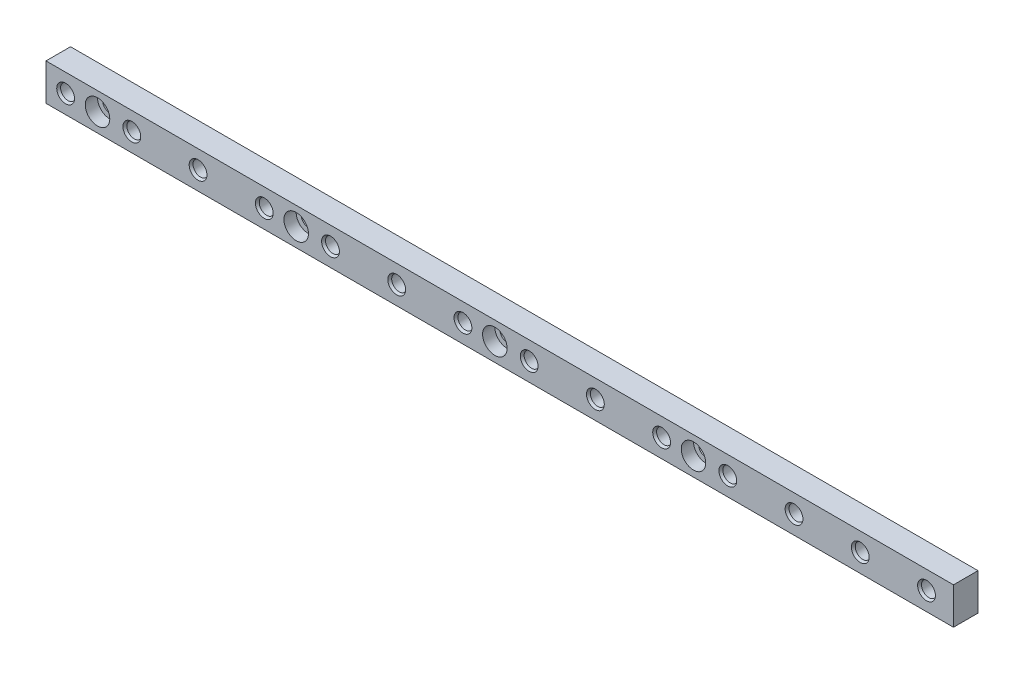
ISO-10303-21;
HEADER;
FILE_DESCRIPTION(('STEP AP214'),'2;1');
FILE_NAME('part.step','',(''),(''),'','','');
FILE_SCHEMA(('AUTOMOTIVE_DESIGN { 1 0 10303 214 1 1 1 1 }'));
ENDSEC;
DATA;
#1=APPLICATION_CONTEXT('core data for automotive mechanical design processes');
#2=APPLICATION_PROTOCOL_DEFINITION('international standard','automotive_design',2000,#1);
#3=PRODUCT_CONTEXT('',#1,'mechanical');
#4=PRODUCT('Part','Part','',(#3));
#5=PRODUCT_RELATED_PRODUCT_CATEGORY('part','',(#4));
#6=PRODUCT_DEFINITION_FORMATION('','',#4);
#7=PRODUCT_DEFINITION_CONTEXT('part definition',#1,'design');
#8=PRODUCT_DEFINITION('design','',#6,#7);
#9=PRODUCT_DEFINITION_SHAPE('','',#8);
#10=(LENGTH_UNIT() NAMED_UNIT(*) SI_UNIT(.MILLI.,.METRE.));
#11=(NAMED_UNIT(*) PLANE_ANGLE_UNIT() SI_UNIT($,.RADIAN.));
#12=(NAMED_UNIT(*) SI_UNIT($,.STERADIAN.) SOLID_ANGLE_UNIT());
#13=UNCERTAINTY_MEASURE_WITH_UNIT(LENGTH_MEASURE(1.E-05),#10,'distance_accuracy_value','');
#14=(GEOMETRIC_REPRESENTATION_CONTEXT(3) GLOBAL_UNCERTAINTY_ASSIGNED_CONTEXT((#13)) GLOBAL_UNIT_ASSIGNED_CONTEXT((#10,
#11,#12)) REPRESENTATION_CONTEXT('',''));
#15=CARTESIAN_POINT('',(0.,0.,0.));
#16=DIRECTION('',(0.,0.,1.));
#17=DIRECTION('',(1.,0.,0.));
#18=AXIS2_PLACEMENT_3D('',#15,#16,#17);
#19=CARTESIAN_POINT('',(0.,0.,10.));
#20=DIRECTION('',(1.,0.,0.));
#21=DIRECTION('',(0.,0.,-1.));
#22=AXIS2_PLACEMENT_3D('',#19,#20,#21);
#23=PLANE('',#22);
#24=DIRECTION('',(0.,-1.,0.));
#25=VECTOR('',#24,1.);
#26=CARTESIAN_POINT('',(0.,0.,0.));
#27=LINE('',#26,#25);
#28=CARTESIAN_POINT('',(0.,15.,0.));
#29=VERTEX_POINT('',#28);
#30=CARTESIAN_POINT('',(0.,0.,0.));
#31=VERTEX_POINT('',#30);
#32=EDGE_CURVE('E105',#29,#31,#27,.T.);
#33=ORIENTED_EDGE('',*,*,#32,.T.);
#34=DIRECTION('',(0.,0.,-1.));
#35=VECTOR('',#34,1.);
#36=CARTESIAN_POINT('',(0.,0.,10.));
#37=LINE('',#36,#35);
#38=CARTESIAN_POINT('',(0.,0.,10.));
#39=VERTEX_POINT('',#38);
#40=EDGE_CURVE('E96',#39,#31,#37,.T.);
#41=ORIENTED_EDGE('',*,*,#40,.F.);
#42=DIRECTION('',(0.,-1.,0.));
#43=VECTOR('',#42,1.);
#44=CARTESIAN_POINT('',(0.,0.,10.));
#45=LINE('',#44,#43);
#46=CARTESIAN_POINT('',(0.,15.,10.));
#47=VERTEX_POINT('',#46);
#48=EDGE_CURVE('E90',#47,#39,#45,.T.);
#49=ORIENTED_EDGE('',*,*,#48,.F.);
#50=DIRECTION('',(0.,0.,-1.));
#51=VECTOR('',#50,1.);
#52=CARTESIAN_POINT('',(0.,15.,10.));
#53=LINE('',#52,#51);
#54=EDGE_CURVE('E101',#47,#29,#53,.T.);
#55=ORIENTED_EDGE('',*,*,#54,.T.);
#56=EDGE_LOOP('',(#33,#41,#49,#55));
#57=FACE_BOUND('',#56,.T.);
#58=ADVANCED_FACE('F37',(#57),#23,.F.);
#59=CARTESIAN_POINT('',(0.,0.,10.));
#60=DIRECTION('',(0.,1.,0.));
#61=DIRECTION('',(0.,0.,1.));
#62=AXIS2_PLACEMENT_3D('',#59,#60,#61);
#63=PLANE('',#62);
#64=DIRECTION('',(1.,0.,0.));
#65=VECTOR('',#64,1.);
#66=CARTESIAN_POINT('',(0.,0.,0.));
#67=LINE('',#66,#65);
#68=CARTESIAN_POINT('',(370.,0.,0.));
#69=VERTEX_POINT('',#68);
#70=EDGE_CURVE('E95',#31,#69,#67,.T.);
#71=ORIENTED_EDGE('',*,*,#70,.T.);
#72=DIRECTION('',(0.,0.,-1.));
#73=VECTOR('',#72,1.);
#74=CARTESIAN_POINT('',(370.,0.,10.));
#75=LINE('',#74,#73);
#76=CARTESIAN_POINT('',(370.,0.,10.));
#77=VERTEX_POINT('',#76);
#78=EDGE_CURVE('E93',#77,#69,#75,.T.);
#79=ORIENTED_EDGE('',*,*,#78,.F.);
#80=DIRECTION('',(1.,0.,0.));
#81=VECTOR('',#80,1.);
#82=CARTESIAN_POINT('',(0.,0.,10.));
#83=LINE('',#82,#81);
#84=EDGE_CURVE('E85',#39,#77,#83,.T.);
#85=ORIENTED_EDGE('',*,*,#84,.F.);
#86=ORIENTED_EDGE('',*,*,#40,.T.);
#87=EDGE_LOOP('',(#71,#79,#85,#86));
#88=FACE_BOUND('',#87,.T.);
#89=ADVANCED_FACE('F94',(#88),#63,.F.);
#90=CARTESIAN_POINT('',(370.,0.,10.));
#91=DIRECTION('',(-1.,0.,0.));
#92=DIRECTION('',(0.,0.,1.));
#93=AXIS2_PLACEMENT_3D('',#90,#91,#92);
#94=PLANE('',#93);
#95=DIRECTION('',(0.,1.,0.));
#96=VECTOR('',#95,1.);
#97=CARTESIAN_POINT('',(370.,0.,0.));
#98=LINE('',#97,#96);
#99=CARTESIAN_POINT('',(370.,15.,0.));
#100=VERTEX_POINT('',#99);
#101=EDGE_CURVE('E71',#69,#100,#98,.T.);
#102=ORIENTED_EDGE('',*,*,#101,.T.);
#103=DIRECTION('',(0.,0.,-1.));
#104=VECTOR('',#103,1.);
#105=CARTESIAN_POINT('',(370.,15.,10.));
#106=LINE('',#105,#104);
#107=CARTESIAN_POINT('',(370.,15.,10.));
#108=VERTEX_POINT('',#107);
#109=EDGE_CURVE('E97',#108,#100,#106,.T.);
#110=ORIENTED_EDGE('',*,*,#109,.F.);
#111=DIRECTION('',(0.,1.,0.));
#112=VECTOR('',#111,1.);
#113=CARTESIAN_POINT('',(370.,0.,10.));
#114=LINE('',#113,#112);
#115=EDGE_CURVE('E88',#77,#108,#114,.T.);
#116=ORIENTED_EDGE('',*,*,#115,.F.);
#117=ORIENTED_EDGE('',*,*,#78,.T.);
#118=EDGE_LOOP('',(#102,#110,#116,#117));
#119=FACE_BOUND('',#118,.T.);
#120=ADVANCED_FACE('F99',(#119),#94,.F.);
#121=CARTESIAN_POINT('',(0.,15.,10.));
#122=DIRECTION('',(0.,-1.,0.));
#123=DIRECTION('',(0.,0.,-1.));
#124=AXIS2_PLACEMENT_3D('',#121,#122,#123);
#125=PLANE('',#124);
#126=DIRECTION('',(-1.,0.,0.));
#127=VECTOR('',#126,1.);
#128=CARTESIAN_POINT('',(0.,15.,0.));
#129=LINE('',#128,#127);
#130=EDGE_CURVE('E77',#100,#29,#129,.T.);
#131=ORIENTED_EDGE('',*,*,#130,.T.);
#132=ORIENTED_EDGE('',*,*,#54,.F.);
#133=DIRECTION('',(-1.,0.,0.));
#134=VECTOR('',#133,1.);
#135=CARTESIAN_POINT('',(0.,15.,10.));
#136=LINE('',#135,#134);
#137=EDGE_CURVE('E54',#108,#47,#136,.T.);
#138=ORIENTED_EDGE('',*,*,#137,.F.);
#139=ORIENTED_EDGE('',*,*,#109,.T.);
#140=EDGE_LOOP('',(#131,#132,#138,#139));
#141=FACE_BOUND('',#140,.T.);
#142=ADVANCED_FACE('F397',(#141),#125,.F.);
#143=CARTESIAN_POINT('',(0.,15.,10.));
#144=DIRECTION('',(0.,0.,-1.));
#145=DIRECTION('',(-1.,0.,0.));
#146=AXIS2_PLACEMENT_3D('',#143,#144,#145);
#147=PLANE('',#146);
#148=CARTESIAN_POINT('',(359.,7.5,10.));
#149=DIRECTION('',(0.,0.,-1.));
#150=DIRECTION('',(-1.,0.,0.));
#151=AXIS2_PLACEMENT_3D('',#148,#149,#150);
#152=CIRCLE('',#151,3.62735026918959);
#153=CARTESIAN_POINT('',(355.37264973081,7.5,10.));
#154=VERTEX_POINT('',#153);
#155=EDGE_CURVE('E193',#154,#154,#152,.T.);
#156=ORIENTED_EDGE('',*,*,#155,.T.);
#157=EDGE_LOOP('',(#156));
#158=FACE_BOUND('',#157,.T.);
#159=CARTESIAN_POINT('',(332.,7.5,10.));
#160=DIRECTION('',(0.,0.,-1.));
#161=DIRECTION('',(-1.,0.,0.));
#162=AXIS2_PLACEMENT_3D('',#159,#160,#161);
#163=CIRCLE('',#162,3.6273502691897);
#164=CARTESIAN_POINT('',(328.37264973081,7.5,10.));
#165=VERTEX_POINT('',#164);
#166=EDGE_CURVE('E190',#165,#165,#163,.T.);
#167=ORIENTED_EDGE('',*,*,#166,.T.);
#168=EDGE_LOOP('',(#167));
#169=FACE_BOUND('',#168,.T.);
#170=CARTESIAN_POINT('',(305.,7.5,10.));
#171=DIRECTION('',(0.,0.,-1.));
#172=DIRECTION('',(-1.,0.,0.));
#173=AXIS2_PLACEMENT_3D('',#170,#171,#172);
#174=CIRCLE('',#173,3.62735026918959);
#175=CARTESIAN_POINT('',(301.37264973081,7.5,10.));
#176=VERTEX_POINT('',#175);
#177=EDGE_CURVE('E187',#176,#176,#174,.T.);
#178=ORIENTED_EDGE('',*,*,#177,.T.);
#179=EDGE_LOOP('',(#178));
#180=FACE_BOUND('',#179,.T.);
#181=CARTESIAN_POINT('',(278.,7.5,10.));
#182=DIRECTION('',(0.,0.,-1.));
#183=DIRECTION('',(-1.,0.,0.));
#184=AXIS2_PLACEMENT_3D('',#181,#182,#183);
#185=CIRCLE('',#184,3.62735026918959);
#186=CARTESIAN_POINT('',(274.37264973081,7.5,10.));
#187=VERTEX_POINT('',#186);
#188=EDGE_CURVE('E184',#187,#187,#185,.T.);
#189=ORIENTED_EDGE('',*,*,#188,.T.);
#190=EDGE_LOOP('',(#189));
#191=FACE_BOUND('',#190,.T.);
#192=CARTESIAN_POINT('',(251.,7.5,10.));
#193=DIRECTION('',(0.,0.,-1.));
#194=DIRECTION('',(-1.,0.,0.));
#195=AXIS2_PLACEMENT_3D('',#192,#193,#194);
#196=CIRCLE('',#195,3.62735026918964);
#197=CARTESIAN_POINT('',(247.37264973081,7.5,10.));
#198=VERTEX_POINT('',#197);
#199=EDGE_CURVE('E181',#198,#198,#196,.T.);
#200=ORIENTED_EDGE('',*,*,#199,.T.);
#201=EDGE_LOOP('',(#200));
#202=FACE_BOUND('',#201,.T.);
#203=CARTESIAN_POINT('',(224.,7.5,10.));
#204=DIRECTION('',(0.,0.,-1.));
#205=DIRECTION('',(-1.,0.,0.));
#206=AXIS2_PLACEMENT_3D('',#203,#204,#205);
#207=CIRCLE('',#206,3.62735026918959);
#208=CARTESIAN_POINT('',(220.37264973081,7.5,10.));
#209=VERTEX_POINT('',#208);
#210=EDGE_CURVE('E178',#209,#209,#207,.T.);
#211=ORIENTED_EDGE('',*,*,#210,.T.);
#212=EDGE_LOOP('',(#211));
#213=FACE_BOUND('',#212,.T.);
#214=CARTESIAN_POINT('',(197.,7.5,10.));
#215=DIRECTION('',(0.,0.,-1.));
#216=DIRECTION('',(-1.,0.,0.));
#217=AXIS2_PLACEMENT_3D('',#214,#215,#216);
#218=CIRCLE('',#217,3.62735026918959);
#219=CARTESIAN_POINT('',(193.37264973081,7.5,10.));
#220=VERTEX_POINT('',#219);
#221=EDGE_CURVE('E175',#220,#220,#218,.T.);
#222=ORIENTED_EDGE('',*,*,#221,.T.);
#223=EDGE_LOOP('',(#222));
#224=FACE_BOUND('',#223,.T.);
#225=CARTESIAN_POINT('',(170.,7.5,10.));
#226=DIRECTION('',(0.,0.,-1.));
#227=DIRECTION('',(-1.,0.,0.));
#228=AXIS2_PLACEMENT_3D('',#225,#226,#227);
#229=CIRCLE('',#228,3.6273502691897);
#230=CARTESIAN_POINT('',(166.37264973081,7.5,10.));
#231=VERTEX_POINT('',#230);
#232=EDGE_CURVE('E172',#231,#231,#229,.T.);
#233=ORIENTED_EDGE('',*,*,#232,.T.);
#234=EDGE_LOOP('',(#233));
#235=FACE_BOUND('',#234,.T.);
#236=CARTESIAN_POINT('',(143.,7.5,10.));
#237=DIRECTION('',(0.,0.,-1.));
#238=DIRECTION('',(-1.,0.,0.));
#239=AXIS2_PLACEMENT_3D('',#236,#237,#238);
#240=CIRCLE('',#239,3.62735026918959);
#241=CARTESIAN_POINT('',(139.37264973081,7.5,10.));
#242=VERTEX_POINT('',#241);
#243=EDGE_CURVE('E169',#242,#242,#240,.T.);
#244=ORIENTED_EDGE('',*,*,#243,.T.);
#245=EDGE_LOOP('',(#244));
#246=FACE_BOUND('',#245,.T.);
#247=CARTESIAN_POINT('',(116.,7.5,10.));
#248=DIRECTION('',(0.,0.,-1.));
#249=DIRECTION('',(-1.,0.,0.));
#250=AXIS2_PLACEMENT_3D('',#247,#248,#249);
#251=CIRCLE('',#250,3.62735026918959);
#252=CARTESIAN_POINT('',(112.37264973081,7.5,10.));
#253=VERTEX_POINT('',#252);
#254=EDGE_CURVE('E166',#253,#253,#251,.T.);
#255=ORIENTED_EDGE('',*,*,#254,.T.);
#256=EDGE_LOOP('',(#255));
#257=FACE_BOUND('',#256,.T.);
#258=CARTESIAN_POINT('',(89.,7.5,10.));
#259=DIRECTION('',(0.,0.,-1.));
#260=DIRECTION('',(-1.,0.,0.));
#261=AXIS2_PLACEMENT_3D('',#258,#259,#260);
#262=CIRCLE('',#261,3.62735026918959);
#263=CARTESIAN_POINT('',(85.3726497308104,7.5,10.));
#264=VERTEX_POINT('',#263);
#265=EDGE_CURVE('E163',#264,#264,#262,.T.);
#266=ORIENTED_EDGE('',*,*,#265,.T.);
#267=EDGE_LOOP('',(#266));
#268=FACE_BOUND('',#267,.T.);
#269=CARTESIAN_POINT('',(62.,7.5,10.));
#270=DIRECTION('',(0.,0.,-1.));
#271=DIRECTION('',(-1.,0.,0.));
#272=AXIS2_PLACEMENT_3D('',#269,#270,#271);
#273=CIRCLE('',#272,3.62735026918964);
#274=CARTESIAN_POINT('',(58.3726497308104,7.5,10.));
#275=VERTEX_POINT('',#274);
#276=EDGE_CURVE('E160',#275,#275,#273,.T.);
#277=ORIENTED_EDGE('',*,*,#276,.T.);
#278=EDGE_LOOP('',(#277));
#279=FACE_BOUND('',#278,.T.);
#280=CARTESIAN_POINT('',(35.,7.5,10.));
#281=DIRECTION('',(0.,0.,-1.));
#282=DIRECTION('',(-1.,0.,0.));
#283=AXIS2_PLACEMENT_3D('',#280,#281,#282);
#284=CIRCLE('',#283,3.62735026918964);
#285=CARTESIAN_POINT('',(31.3726497308104,7.5,10.));
#286=VERTEX_POINT('',#285);
#287=EDGE_CURVE('E157',#286,#286,#284,.T.);
#288=ORIENTED_EDGE('',*,*,#287,.T.);
#289=EDGE_LOOP('',(#288));
#290=FACE_BOUND('',#289,.T.);
#291=CARTESIAN_POINT('',(8.,7.5,10.));
#292=DIRECTION('',(0.,0.,-1.));
#293=DIRECTION('',(-1.,0.,0.));
#294=AXIS2_PLACEMENT_3D('',#291,#292,#293);
#295=CIRCLE('',#294,3.62735026918962);
#296=CARTESIAN_POINT('',(4.37264973081039,7.5,10.));
#297=VERTEX_POINT('',#296);
#298=EDGE_CURVE('E154',#297,#297,#295,.T.);
#299=ORIENTED_EDGE('',*,*,#298,.T.);
#300=EDGE_LOOP('',(#299));
#301=FACE_BOUND('',#300,.T.);
#302=CARTESIAN_POINT('',(21.,7.5,10.));
#303=DIRECTION('',(0.,0.,1.));
#304=DIRECTION('',(1.,0.,0.));
#305=AXIS2_PLACEMENT_3D('',#302,#303,#304);
#306=CIRCLE('',#305,5.);
#307=CARTESIAN_POINT('',(26.,7.5,10.));
#308=VERTEX_POINT('',#307);
#309=EDGE_CURVE('E798',#308,#308,#306,.T.);
#310=ORIENTED_EDGE('',*,*,#309,.F.);
#311=EDGE_LOOP('',(#310));
#312=FACE_BOUND('',#311,.T.);
#313=CARTESIAN_POINT('',(102.,7.5,10.));
#314=DIRECTION('',(0.,0.,1.));
#315=DIRECTION('',(1.,0.,0.));
#316=AXIS2_PLACEMENT_3D('',#313,#314,#315);
#317=CIRCLE('',#316,5.);
#318=CARTESIAN_POINT('',(107.,7.5,10.));
#319=VERTEX_POINT('',#318);
#320=EDGE_CURVE('E787',#319,#319,#317,.T.);
#321=ORIENTED_EDGE('',*,*,#320,.F.);
#322=EDGE_LOOP('',(#321));
#323=FACE_BOUND('',#322,.T.);
#324=CARTESIAN_POINT('',(183.,7.5,10.));
#325=DIRECTION('',(0.,0.,1.));
#326=DIRECTION('',(1.,0.,0.));
#327=AXIS2_PLACEMENT_3D('',#324,#325,#326);
#328=CIRCLE('',#327,5.);
#329=CARTESIAN_POINT('',(188.,7.5,10.));
#330=VERTEX_POINT('',#329);
#331=EDGE_CURVE('E775',#330,#330,#328,.T.);
#332=ORIENTED_EDGE('',*,*,#331,.F.);
#333=EDGE_LOOP('',(#332));
#334=FACE_BOUND('',#333,.T.);
#335=CARTESIAN_POINT('',(264.,7.5,10.));
#336=DIRECTION('',(0.,0.,1.));
#337=DIRECTION('',(1.,0.,0.));
#338=AXIS2_PLACEMENT_3D('',#335,#336,#337);
#339=CIRCLE('',#338,5.);
#340=CARTESIAN_POINT('',(269.,7.5,10.));
#341=VERTEX_POINT('',#340);
#342=EDGE_CURVE('E747',#341,#341,#339,.T.);
#343=ORIENTED_EDGE('',*,*,#342,.F.);
#344=EDGE_LOOP('',(#343));
#345=FACE_BOUND('',#344,.T.);
#346=ORIENTED_EDGE('',*,*,#48,.T.);
#347=ORIENTED_EDGE('',*,*,#84,.T.);
#348=ORIENTED_EDGE('',*,*,#115,.T.);
#349=ORIENTED_EDGE('',*,*,#137,.T.);
#350=EDGE_LOOP('',(#346,#347,#348,#349));
#351=FACE_BOUND('',#350,.T.);
#352=ADVANCED_FACE('F86',(#158,#169,#180,#191,#202,#213,#224,#235,#246,#257,#268,#279,#290,#301,
#312,#323,#334,#345,#351),#147,.F.);
#353=CARTESIAN_POINT('',(0.,15.,0.));
#354=DIRECTION('',(0.,0.,-1.));
#355=DIRECTION('',(-1.,0.,0.));
#356=AXIS2_PLACEMENT_3D('',#353,#354,#355);
#357=PLANE('',#356);
#358=CARTESIAN_POINT('',(21.,7.5,0.));
#359=DIRECTION('',(0.,0.,1.));
#360=DIRECTION('',(1.,0.,0.));
#361=AXIS2_PLACEMENT_3D('',#358,#359,#360);
#362=CIRCLE('',#361,2.9);
#363=CARTESIAN_POINT('',(23.9,7.5,0.));
#364=VERTEX_POINT('',#363);
#365=EDGE_CURVE('E790',#364,#364,#362,.T.);
#366=ORIENTED_EDGE('',*,*,#365,.T.);
#367=EDGE_LOOP('',(#366));
#368=FACE_BOUND('',#367,.T.);
#369=CARTESIAN_POINT('',(102.,7.5,0.));
#370=DIRECTION('',(0.,0.,1.));
#371=DIRECTION('',(1.,0.,0.));
#372=AXIS2_PLACEMENT_3D('',#369,#370,#371);
#373=CIRCLE('',#372,2.9);
#374=CARTESIAN_POINT('',(104.9,7.5,0.));
#375=VERTEX_POINT('',#374);
#376=EDGE_CURVE('E778',#375,#375,#373,.T.);
#377=ORIENTED_EDGE('',*,*,#376,.T.);
#378=EDGE_LOOP('',(#377));
#379=FACE_BOUND('',#378,.T.);
#380=CARTESIAN_POINT('',(183.,7.5,0.));
#381=DIRECTION('',(0.,0.,1.));
#382=DIRECTION('',(1.,0.,0.));
#383=AXIS2_PLACEMENT_3D('',#380,#381,#382);
#384=CIRCLE('',#383,2.89999999999999);
#385=CARTESIAN_POINT('',(185.9,7.5,0.));
#386=VERTEX_POINT('',#385);
#387=EDGE_CURVE('E766',#386,#386,#384,.T.);
#388=ORIENTED_EDGE('',*,*,#387,.T.);
#389=EDGE_LOOP('',(#388));
#390=FACE_BOUND('',#389,.T.);
#391=CARTESIAN_POINT('',(264.,7.5,0.));
#392=DIRECTION('',(0.,0.,1.));
#393=DIRECTION('',(1.,0.,0.));
#394=AXIS2_PLACEMENT_3D('',#391,#392,#393);
#395=CIRCLE('',#394,2.90000000000001);
#396=CARTESIAN_POINT('',(266.9,7.5,0.));
#397=VERTEX_POINT('',#396);
#398=EDGE_CURVE('E738',#397,#397,#395,.T.);
#399=ORIENTED_EDGE('',*,*,#398,.T.);
#400=EDGE_LOOP('',(#399));
#401=FACE_BOUND('',#400,.T.);
#402=CARTESIAN_POINT('',(35.,7.5,0.));
#403=DIRECTION('',(0.,0.,1.));
#404=DIRECTION('',(1.,0.,0.));
#405=AXIS2_PLACEMENT_3D('',#402,#403,#404);
#406=CIRCLE('',#405,3.05);
#407=CARTESIAN_POINT('',(38.05,7.5,0.));
#408=VERTEX_POINT('',#407);
#409=EDGE_CURVE('E744',#408,#408,#406,.T.);
#410=ORIENTED_EDGE('',*,*,#409,.T.);
#411=EDGE_LOOP('',(#410));
#412=FACE_BOUND('',#411,.T.);
#413=CARTESIAN_POINT('',(8.,7.5,0.));
#414=DIRECTION('',(0.,0.,1.));
#415=DIRECTION('',(1.,0.,0.));
#416=AXIS2_PLACEMENT_3D('',#413,#414,#415);
#417=CIRCLE('',#416,3.05);
#418=CARTESIAN_POINT('',(11.05,7.5,0.));
#419=VERTEX_POINT('',#418);
#420=EDGE_CURVE('E108',#419,#419,#417,.T.);
#421=ORIENTED_EDGE('',*,*,#420,.T.);
#422=EDGE_LOOP('',(#421));
#423=FACE_BOUND('',#422,.T.);
#424=ORIENTED_EDGE('',*,*,#32,.F.);
#425=ORIENTED_EDGE('',*,*,#130,.F.);
#426=ORIENTED_EDGE('',*,*,#101,.F.);
#427=ORIENTED_EDGE('',*,*,#70,.F.);
#428=EDGE_LOOP('',(#424,#425,#426,#427));
#429=FACE_BOUND('',#428,.T.);
#430=CARTESIAN_POINT('',(62.,7.5,0.));
#431=DIRECTION('',(0.,0.,1.));
#432=DIRECTION('',(1.,0.,0.));
#433=AXIS2_PLACEMENT_3D('',#430,#431,#432);
#434=CIRCLE('',#433,3.05);
#435=CARTESIAN_POINT('',(65.05,7.5,0.));
#436=VERTEX_POINT('',#435);
#437=EDGE_CURVE('E115',#436,#436,#434,.T.);
#438=ORIENTED_EDGE('',*,*,#437,.T.);
#439=EDGE_LOOP('',(#438));
#440=FACE_BOUND('',#439,.T.);
#441=CARTESIAN_POINT('',(89.,7.5,0.));
#442=DIRECTION('',(0.,0.,1.));
#443=DIRECTION('',(1.,0.,0.));
#444=AXIS2_PLACEMENT_3D('',#441,#442,#443);
#445=CIRCLE('',#444,3.05);
#446=CARTESIAN_POINT('',(92.05,7.5,0.));
#447=VERTEX_POINT('',#446);
#448=EDGE_CURVE('E118',#447,#447,#445,.T.);
#449=ORIENTED_EDGE('',*,*,#448,.T.);
#450=EDGE_LOOP('',(#449));
#451=FACE_BOUND('',#450,.T.);
#452=CARTESIAN_POINT('',(116.,7.5,0.));
#453=DIRECTION('',(0.,0.,1.));
#454=DIRECTION('',(1.,0.,0.));
#455=AXIS2_PLACEMENT_3D('',#452,#453,#454);
#456=CIRCLE('',#455,3.05);
#457=CARTESIAN_POINT('',(119.05,7.5,0.));
#458=VERTEX_POINT('',#457);
#459=EDGE_CURVE('E121',#458,#458,#456,.T.);
#460=ORIENTED_EDGE('',*,*,#459,.T.);
#461=EDGE_LOOP('',(#460));
#462=FACE_BOUND('',#461,.T.);
#463=CARTESIAN_POINT('',(143.,7.5,0.));
#464=DIRECTION('',(0.,0.,1.));
#465=DIRECTION('',(1.,0.,0.));
#466=AXIS2_PLACEMENT_3D('',#463,#464,#465);
#467=CIRCLE('',#466,3.05);
#468=CARTESIAN_POINT('',(146.05,7.5,0.));
#469=VERTEX_POINT('',#468);
#470=EDGE_CURVE('E124',#469,#469,#467,.T.);
#471=ORIENTED_EDGE('',*,*,#470,.T.);
#472=EDGE_LOOP('',(#471));
#473=FACE_BOUND('',#472,.T.);
#474=CARTESIAN_POINT('',(170.,7.5,0.));
#475=DIRECTION('',(0.,0.,1.));
#476=DIRECTION('',(1.,0.,0.));
#477=AXIS2_PLACEMENT_3D('',#474,#475,#476);
#478=CIRCLE('',#477,3.05);
#479=CARTESIAN_POINT('',(173.05,7.5,0.));
#480=VERTEX_POINT('',#479);
#481=EDGE_CURVE('E127',#480,#480,#478,.T.);
#482=ORIENTED_EDGE('',*,*,#481,.T.);
#483=EDGE_LOOP('',(#482));
#484=FACE_BOUND('',#483,.T.);
#485=CARTESIAN_POINT('',(197.,7.5,0.));
#486=DIRECTION('',(0.,0.,1.));
#487=DIRECTION('',(1.,0.,0.));
#488=AXIS2_PLACEMENT_3D('',#485,#486,#487);
#489=CIRCLE('',#488,3.05);
#490=CARTESIAN_POINT('',(200.05,7.5,0.));
#491=VERTEX_POINT('',#490);
#492=EDGE_CURVE('E130',#491,#491,#489,.T.);
#493=ORIENTED_EDGE('',*,*,#492,.T.);
#494=EDGE_LOOP('',(#493));
#495=FACE_BOUND('',#494,.T.);
#496=CARTESIAN_POINT('',(224.,7.5,0.));
#497=DIRECTION('',(0.,0.,1.));
#498=DIRECTION('',(1.,0.,0.));
#499=AXIS2_PLACEMENT_3D('',#496,#497,#498);
#500=CIRCLE('',#499,3.05);
#501=CARTESIAN_POINT('',(227.05,7.5,0.));
#502=VERTEX_POINT('',#501);
#503=EDGE_CURVE('E133',#502,#502,#500,.T.);
#504=ORIENTED_EDGE('',*,*,#503,.T.);
#505=EDGE_LOOP('',(#504));
#506=FACE_BOUND('',#505,.T.);
#507=CARTESIAN_POINT('',(251.,7.5,0.));
#508=DIRECTION('',(0.,0.,1.));
#509=DIRECTION('',(1.,0.,0.));
#510=AXIS2_PLACEMENT_3D('',#507,#508,#509);
#511=CIRCLE('',#510,3.05);
#512=CARTESIAN_POINT('',(254.05,7.5,0.));
#513=VERTEX_POINT('',#512);
#514=EDGE_CURVE('E136',#513,#513,#511,.T.);
#515=ORIENTED_EDGE('',*,*,#514,.T.);
#516=EDGE_LOOP('',(#515));
#517=FACE_BOUND('',#516,.T.);
#518=CARTESIAN_POINT('',(278.,7.5,0.));
#519=DIRECTION('',(0.,0.,1.));
#520=DIRECTION('',(1.,0.,0.));
#521=AXIS2_PLACEMENT_3D('',#518,#519,#520);
#522=CIRCLE('',#521,3.05);
#523=CARTESIAN_POINT('',(281.05,7.5,0.));
#524=VERTEX_POINT('',#523);
#525=EDGE_CURVE('E139',#524,#524,#522,.T.);
#526=ORIENTED_EDGE('',*,*,#525,.T.);
#527=EDGE_LOOP('',(#526));
#528=FACE_BOUND('',#527,.T.);
#529=CARTESIAN_POINT('',(305.,7.5,0.));
#530=DIRECTION('',(0.,0.,1.));
#531=DIRECTION('',(1.,0.,0.));
#532=AXIS2_PLACEMENT_3D('',#529,#530,#531);
#533=CIRCLE('',#532,3.05);
#534=CARTESIAN_POINT('',(308.05,7.5,0.));
#535=VERTEX_POINT('',#534);
#536=EDGE_CURVE('E142',#535,#535,#533,.T.);
#537=ORIENTED_EDGE('',*,*,#536,.T.);
#538=EDGE_LOOP('',(#537));
#539=FACE_BOUND('',#538,.T.);
#540=CARTESIAN_POINT('',(332.,7.5,0.));
#541=DIRECTION('',(0.,0.,1.));
#542=DIRECTION('',(1.,0.,0.));
#543=AXIS2_PLACEMENT_3D('',#540,#541,#542);
#544=CIRCLE('',#543,3.05);
#545=CARTESIAN_POINT('',(335.05,7.5,0.));
#546=VERTEX_POINT('',#545);
#547=EDGE_CURVE('E145',#546,#546,#544,.T.);
#548=ORIENTED_EDGE('',*,*,#547,.T.);
#549=EDGE_LOOP('',(#548));
#550=FACE_BOUND('',#549,.T.);
#551=CARTESIAN_POINT('',(359.,7.5,0.));
#552=DIRECTION('',(0.,0.,1.));
#553=DIRECTION('',(1.,0.,0.));
#554=AXIS2_PLACEMENT_3D('',#551,#552,#553);
#555=CIRCLE('',#554,3.05);
#556=CARTESIAN_POINT('',(362.05,7.5,0.));
#557=VERTEX_POINT('',#556);
#558=EDGE_CURVE('E148',#557,#557,#555,.T.);
#559=ORIENTED_EDGE('',*,*,#558,.T.);
#560=EDGE_LOOP('',(#559));
#561=FACE_BOUND('',#560,.T.);
#562=ADVANCED_FACE('F356',(#368,#379,#390,#401,#412,#423,#429,#440,#451,#462,#473,#484,#495,
#506,#517,#528,#539,#550,#561),#357,.T.);
#563=CARTESIAN_POINT('',(8.,7.5,0.));
#564=DIRECTION('',(0.,0.,1.));
#565=DIRECTION('',(1.,0.,0.));
#566=AXIS2_PLACEMENT_3D('',#563,#564,#565);
#567=CYLINDRICAL_SURFACE('',#566,3.05);
#568=CARTESIAN_POINT('',(8.,7.5,9.));
#569=DIRECTION('',(0.,0.,-1.));
#570=DIRECTION('',(-1.,0.,0.));
#571=AXIS2_PLACEMENT_3D('',#568,#569,#570);
#572=CIRCLE('',#571,3.05);
#573=CARTESIAN_POINT('',(4.95,7.5,9.));
#574=VERTEX_POINT('',#573);
#575=EDGE_CURVE('E11',#574,#574,#572,.F.);
#576=ORIENTED_EDGE('',*,*,#575,.T.);
#577=EDGE_LOOP('',(#576));
#578=FACE_BOUND('',#577,.T.);
#579=ORIENTED_EDGE('',*,*,#420,.F.);
#580=EDGE_LOOP('',(#579));
#581=FACE_BOUND('',#580,.T.);
#582=ADVANCED_FACE('F359',(#578,#581),#567,.F.);
#583=CARTESIAN_POINT('',(35.,7.5,0.));
#584=DIRECTION('',(0.,0.,1.));
#585=DIRECTION('',(1.,0.,0.));
#586=AXIS2_PLACEMENT_3D('',#583,#584,#585);
#587=CYLINDRICAL_SURFACE('',#586,3.05);
#588=CARTESIAN_POINT('',(35.,7.5,8.99999999999998));
#589=DIRECTION('',(0.,0.,-1.));
#590=DIRECTION('',(-1.,0.,0.));
#591=AXIS2_PLACEMENT_3D('',#588,#589,#590);
#592=CIRCLE('',#591,3.05);
#593=CARTESIAN_POINT('',(31.95,7.5,8.99999999999998));
#594=VERTEX_POINT('',#593);
#595=EDGE_CURVE('E46',#594,#594,#592,.F.);
#596=ORIENTED_EDGE('',*,*,#595,.T.);
#597=EDGE_LOOP('',(#596));
#598=FACE_BOUND('',#597,.T.);
#599=ORIENTED_EDGE('',*,*,#409,.F.);
#600=EDGE_LOOP('',(#599));
#601=FACE_BOUND('',#600,.T.);
#602=ADVANCED_FACE('F231',(#598,#601),#587,.F.);
#603=CARTESIAN_POINT('',(62.,7.5,0.));
#604=DIRECTION('',(0.,0.,1.));
#605=DIRECTION('',(1.,0.,0.));
#606=AXIS2_PLACEMENT_3D('',#603,#604,#605);
#607=CYLINDRICAL_SURFACE('',#606,3.05);
#608=CARTESIAN_POINT('',(62.,7.5,8.99999999999998));
#609=DIRECTION('',(0.,0.,-1.));
#610=DIRECTION('',(-1.,0.,0.));
#611=AXIS2_PLACEMENT_3D('',#608,#609,#610);
#612=CIRCLE('',#611,3.05);
#613=CARTESIAN_POINT('',(58.95,7.5,8.99999999999998));
#614=VERTEX_POINT('',#613);
#615=EDGE_CURVE('E226',#614,#614,#612,.F.);
#616=ORIENTED_EDGE('',*,*,#615,.T.);
#617=EDGE_LOOP('',(#616));
#618=FACE_BOUND('',#617,.T.);
#619=ORIENTED_EDGE('',*,*,#437,.F.);
#620=EDGE_LOOP('',(#619));
#621=FACE_BOUND('',#620,.T.);
#622=ADVANCED_FACE('F256',(#618,#621),#607,.F.);
#623=CARTESIAN_POINT('',(89.,7.5,0.));
#624=DIRECTION('',(0.,0.,1.));
#625=DIRECTION('',(1.,0.,0.));
#626=AXIS2_PLACEMENT_3D('',#623,#624,#625);
#627=CYLINDRICAL_SURFACE('',#626,3.05);
#628=CARTESIAN_POINT('',(89.,7.5,9.00000000000007));
#629=DIRECTION('',(0.,0.,-1.));
#630=DIRECTION('',(-1.,0.,0.));
#631=AXIS2_PLACEMENT_3D('',#628,#629,#630);
#632=CIRCLE('',#631,3.05);
#633=CARTESIAN_POINT('',(85.95,7.5,9.00000000000007));
#634=VERTEX_POINT('',#633);
#635=EDGE_CURVE('E223',#634,#634,#632,.F.);
#636=ORIENTED_EDGE('',*,*,#635,.T.);
#637=EDGE_LOOP('',(#636));
#638=FACE_BOUND('',#637,.T.);
#639=ORIENTED_EDGE('',*,*,#448,.F.);
#640=EDGE_LOOP('',(#639));
#641=FACE_BOUND('',#640,.T.);
#642=ADVANCED_FACE('F259',(#638,#641),#627,.F.);
#643=CARTESIAN_POINT('',(116.,7.5,0.));
#644=DIRECTION('',(0.,0.,1.));
#645=DIRECTION('',(1.,0.,0.));
#646=AXIS2_PLACEMENT_3D('',#643,#644,#645);
#647=CYLINDRICAL_SURFACE('',#646,3.05);
#648=CARTESIAN_POINT('',(116.,7.5,9.00000000000007));
#649=DIRECTION('',(0.,0.,-1.));
#650=DIRECTION('',(-1.,0.,0.));
#651=AXIS2_PLACEMENT_3D('',#648,#649,#650);
#652=CIRCLE('',#651,3.05);
#653=CARTESIAN_POINT('',(112.95,7.5,9.00000000000007));
#654=VERTEX_POINT('',#653);
#655=EDGE_CURVE('E220',#654,#654,#652,.F.);
#656=ORIENTED_EDGE('',*,*,#655,.T.);
#657=EDGE_LOOP('',(#656));
#658=FACE_BOUND('',#657,.T.);
#659=ORIENTED_EDGE('',*,*,#459,.F.);
#660=EDGE_LOOP('',(#659));
#661=FACE_BOUND('',#660,.T.);
#662=ADVANCED_FACE('F263',(#658,#661),#647,.F.);
#663=CARTESIAN_POINT('',(143.,7.5,0.));
#664=DIRECTION('',(0.,0.,1.));
#665=DIRECTION('',(1.,0.,0.));
#666=AXIS2_PLACEMENT_3D('',#663,#664,#665);
#667=CYLINDRICAL_SURFACE('',#666,3.05);
#668=CARTESIAN_POINT('',(143.,7.5,9.00000000000007));
#669=DIRECTION('',(0.,0.,-1.));
#670=DIRECTION('',(-1.,0.,0.));
#671=AXIS2_PLACEMENT_3D('',#668,#669,#670);
#672=CIRCLE('',#671,3.05);
#673=CARTESIAN_POINT('',(139.95,7.5,9.00000000000007));
#674=VERTEX_POINT('',#673);
#675=EDGE_CURVE('E217',#674,#674,#672,.F.);
#676=ORIENTED_EDGE('',*,*,#675,.T.);
#677=EDGE_LOOP('',(#676));
#678=FACE_BOUND('',#677,.T.);
#679=ORIENTED_EDGE('',*,*,#470,.F.);
#680=EDGE_LOOP('',(#679));
#681=FACE_BOUND('',#680,.T.);
#682=ADVANCED_FACE('F267',(#678,#681),#667,.F.);
#683=CARTESIAN_POINT('',(170.,7.5,0.));
#684=DIRECTION('',(0.,0.,1.));
#685=DIRECTION('',(1.,0.,0.));
#686=AXIS2_PLACEMENT_3D('',#683,#684,#685);
#687=CYLINDRICAL_SURFACE('',#686,3.05);
#688=CARTESIAN_POINT('',(170.,7.5,8.99999999999984));
#689=DIRECTION('',(0.,0.,-1.));
#690=DIRECTION('',(-1.,0.,0.));
#691=AXIS2_PLACEMENT_3D('',#688,#689,#690);
#692=CIRCLE('',#691,3.05);
#693=CARTESIAN_POINT('',(166.95,7.5,8.99999999999984));
#694=VERTEX_POINT('',#693);
#695=EDGE_CURVE('E214',#694,#694,#692,.F.);
#696=ORIENTED_EDGE('',*,*,#695,.T.);
#697=EDGE_LOOP('',(#696));
#698=FACE_BOUND('',#697,.T.);
#699=ORIENTED_EDGE('',*,*,#481,.F.);
#700=EDGE_LOOP('',(#699));
#701=FACE_BOUND('',#700,.T.);
#702=ADVANCED_FACE('F271',(#698,#701),#687,.F.);
#703=CARTESIAN_POINT('',(197.,7.5,0.));
#704=DIRECTION('',(0.,0.,1.));
#705=DIRECTION('',(1.,0.,0.));
#706=AXIS2_PLACEMENT_3D('',#703,#704,#705);
#707=CYLINDRICAL_SURFACE('',#706,3.05);
#708=CARTESIAN_POINT('',(197.,7.5,9.00000000000007));
#709=DIRECTION('',(0.,0.,-1.));
#710=DIRECTION('',(-1.,0.,0.));
#711=AXIS2_PLACEMENT_3D('',#708,#709,#710);
#712=CIRCLE('',#711,3.05);
#713=CARTESIAN_POINT('',(193.95,7.5,9.00000000000007));
#714=VERTEX_POINT('',#713);
#715=EDGE_CURVE('E211',#714,#714,#712,.F.);
#716=ORIENTED_EDGE('',*,*,#715,.T.);
#717=EDGE_LOOP('',(#716));
#718=FACE_BOUND('',#717,.T.);
#719=ORIENTED_EDGE('',*,*,#492,.F.);
#720=EDGE_LOOP('',(#719));
#721=FACE_BOUND('',#720,.T.);
#722=ADVANCED_FACE('F275',(#718,#721),#707,.F.);
#723=CARTESIAN_POINT('',(224.,7.5,0.));
#724=DIRECTION('',(0.,0.,1.));
#725=DIRECTION('',(1.,0.,0.));
#726=AXIS2_PLACEMENT_3D('',#723,#724,#725);
#727=CYLINDRICAL_SURFACE('',#726,3.05);
#728=CARTESIAN_POINT('',(224.,7.5,9.00000000000007));
#729=DIRECTION('',(0.,0.,-1.));
#730=DIRECTION('',(-1.,0.,0.));
#731=AXIS2_PLACEMENT_3D('',#728,#729,#730);
#732=CIRCLE('',#731,3.05);
#733=CARTESIAN_POINT('',(220.95,7.5,9.00000000000007));
#734=VERTEX_POINT('',#733);
#735=EDGE_CURVE('E208',#734,#734,#732,.F.);
#736=ORIENTED_EDGE('',*,*,#735,.T.);
#737=EDGE_LOOP('',(#736));
#738=FACE_BOUND('',#737,.T.);
#739=ORIENTED_EDGE('',*,*,#503,.F.);
#740=EDGE_LOOP('',(#739));
#741=FACE_BOUND('',#740,.T.);
#742=ADVANCED_FACE('F279',(#738,#741),#727,.F.);
#743=CARTESIAN_POINT('',(251.,7.5,0.));
#744=DIRECTION('',(0.,0.,1.));
#745=DIRECTION('',(1.,0.,0.));
#746=AXIS2_PLACEMENT_3D('',#743,#744,#745);
#747=CYLINDRICAL_SURFACE('',#746,3.05);
#748=CARTESIAN_POINT('',(251.,7.5,9.00000000000007));
#749=DIRECTION('',(0.,0.,-1.));
#750=DIRECTION('',(-1.,0.,0.));
#751=AXIS2_PLACEMENT_3D('',#748,#749,#750);
#752=CIRCLE('',#751,3.05);
#753=CARTESIAN_POINT('',(247.95,7.5,9.00000000000007));
#754=VERTEX_POINT('',#753);
#755=EDGE_CURVE('E205',#754,#754,#752,.F.);
#756=ORIENTED_EDGE('',*,*,#755,.T.);
#757=EDGE_LOOP('',(#756));
#758=FACE_BOUND('',#757,.T.);
#759=ORIENTED_EDGE('',*,*,#514,.F.);
#760=EDGE_LOOP('',(#759));
#761=FACE_BOUND('',#760,.T.);
#762=ADVANCED_FACE('F283',(#758,#761),#747,.F.);
#763=CARTESIAN_POINT('',(278.,7.5,0.));
#764=DIRECTION('',(0.,0.,1.));
#765=DIRECTION('',(1.,0.,0.));
#766=AXIS2_PLACEMENT_3D('',#763,#764,#765);
#767=CYLINDRICAL_SURFACE('',#766,3.05);
#768=CARTESIAN_POINT('',(278.,7.5,9.00000000000007));
#769=DIRECTION('',(0.,0.,-1.));
#770=DIRECTION('',(-1.,0.,0.));
#771=AXIS2_PLACEMENT_3D('',#768,#769,#770);
#772=CIRCLE('',#771,3.05);
#773=CARTESIAN_POINT('',(274.95,7.5,9.00000000000007));
#774=VERTEX_POINT('',#773);
#775=EDGE_CURVE('E202',#774,#774,#772,.F.);
#776=ORIENTED_EDGE('',*,*,#775,.T.);
#777=EDGE_LOOP('',(#776));
#778=FACE_BOUND('',#777,.T.);
#779=ORIENTED_EDGE('',*,*,#525,.F.);
#780=EDGE_LOOP('',(#779));
#781=FACE_BOUND('',#780,.T.);
#782=ADVANCED_FACE('F287',(#778,#781),#767,.F.);
#783=CARTESIAN_POINT('',(305.,7.5,0.));
#784=DIRECTION('',(0.,0.,1.));
#785=DIRECTION('',(1.,0.,0.));
#786=AXIS2_PLACEMENT_3D('',#783,#784,#785);
#787=CYLINDRICAL_SURFACE('',#786,3.05);
#788=CARTESIAN_POINT('',(305.,7.5,9.00000000000007));
#789=DIRECTION('',(0.,0.,-1.));
#790=DIRECTION('',(-1.,0.,0.));
#791=AXIS2_PLACEMENT_3D('',#788,#789,#790);
#792=CIRCLE('',#791,3.05);
#793=CARTESIAN_POINT('',(301.95,7.5,9.00000000000007));
#794=VERTEX_POINT('',#793);
#795=EDGE_CURVE('E199',#794,#794,#792,.F.);
#796=ORIENTED_EDGE('',*,*,#795,.T.);
#797=EDGE_LOOP('',(#796));
#798=FACE_BOUND('',#797,.T.);
#799=ORIENTED_EDGE('',*,*,#536,.F.);
#800=EDGE_LOOP('',(#799));
#801=FACE_BOUND('',#800,.T.);
#802=ADVANCED_FACE('F291',(#798,#801),#787,.F.);
#803=CARTESIAN_POINT('',(332.,7.5,0.));
#804=DIRECTION('',(0.,0.,1.));
#805=DIRECTION('',(1.,0.,0.));
#806=AXIS2_PLACEMENT_3D('',#803,#804,#805);
#807=CYLINDRICAL_SURFACE('',#806,3.05);
#808=CARTESIAN_POINT('',(332.,7.5,8.99999999999984));
#809=DIRECTION('',(0.,0.,-1.));
#810=DIRECTION('',(-1.,0.,0.));
#811=AXIS2_PLACEMENT_3D('',#808,#809,#810);
#812=CIRCLE('',#811,3.05);
#813=CARTESIAN_POINT('',(328.95,7.5,8.99999999999984));
#814=VERTEX_POINT('',#813);
#815=EDGE_CURVE('E196',#814,#814,#812,.F.);
#816=ORIENTED_EDGE('',*,*,#815,.T.);
#817=EDGE_LOOP('',(#816));
#818=FACE_BOUND('',#817,.T.);
#819=ORIENTED_EDGE('',*,*,#547,.F.);
#820=EDGE_LOOP('',(#819));
#821=FACE_BOUND('',#820,.T.);
#822=ADVANCED_FACE('F295',(#818,#821),#807,.F.);
#823=CARTESIAN_POINT('',(359.,7.5,0.));
#824=DIRECTION('',(0.,0.,1.));
#825=DIRECTION('',(1.,0.,0.));
#826=AXIS2_PLACEMENT_3D('',#823,#824,#825);
#827=CYLINDRICAL_SURFACE('',#826,3.05);
#828=CARTESIAN_POINT('',(359.,7.5,9.00000000000007));
#829=DIRECTION('',(0.,0.,-1.));
#830=DIRECTION('',(-1.,0.,0.));
#831=AXIS2_PLACEMENT_3D('',#828,#829,#830);
#832=CIRCLE('',#831,3.05);
#833=CARTESIAN_POINT('',(355.95,7.5,9.00000000000007));
#834=VERTEX_POINT('',#833);
#835=EDGE_CURVE('E151',#834,#834,#832,.F.);
#836=ORIENTED_EDGE('',*,*,#835,.T.);
#837=EDGE_LOOP('',(#836));
#838=FACE_BOUND('',#837,.T.);
#839=ORIENTED_EDGE('',*,*,#558,.F.);
#840=EDGE_LOOP('',(#839));
#841=FACE_BOUND('',#840,.T.);
#842=ADVANCED_FACE('F299',(#838,#841),#827,.F.);
#843=CARTESIAN_POINT('',(264.,7.5,10.));
#844=DIRECTION('',(0.,0.,1.));
#845=DIRECTION('',(1.,0.,0.));
#846=AXIS2_PLACEMENT_3D('',#843,#844,#845);
#847=CYLINDRICAL_SURFACE('',#846,2.90000000000001);
#848=ORIENTED_EDGE('',*,*,#398,.F.);
#849=EDGE_LOOP('',(#848));
#850=FACE_BOUND('',#849,.T.);
#851=CARTESIAN_POINT('',(264.,7.5,5.));
#852=DIRECTION('',(0.,0.,1.));
#853=DIRECTION('',(1.,0.,0.));
#854=AXIS2_PLACEMENT_3D('',#851,#852,#853);
#855=CIRCLE('',#854,2.90000000000001);
#856=CARTESIAN_POINT('',(266.9,7.5,5.));
#857=VERTEX_POINT('',#856);
#858=EDGE_CURVE('E741',#857,#857,#855,.T.);
#859=ORIENTED_EDGE('',*,*,#858,.T.);
#860=EDGE_LOOP('',(#859));
#861=FACE_BOUND('',#860,.T.);
#862=ADVANCED_FACE('F303',(#850,#861),#847,.F.);
#863=CARTESIAN_POINT('',(266.9,7.5,5.));
#864=DIRECTION('',(0.,0.,-1.));
#865=DIRECTION('',(-1.,0.,0.));
#866=AXIS2_PLACEMENT_3D('',#863,#864,#865);
#867=PLANE('',#866);
#868=ORIENTED_EDGE('',*,*,#858,.F.);
#869=EDGE_LOOP('',(#868));
#870=FACE_BOUND('',#869,.T.);
#871=CARTESIAN_POINT('',(264.,7.5,5.));
#872=DIRECTION('',(0.,0.,1.));
#873=DIRECTION('',(1.,0.,0.));
#874=AXIS2_PLACEMENT_3D('',#871,#872,#873);
#875=CIRCLE('',#874,5.);
#876=CARTESIAN_POINT('',(269.,7.5,5.));
#877=VERTEX_POINT('',#876);
#878=EDGE_CURVE('E742',#877,#877,#875,.T.);
#879=ORIENTED_EDGE('',*,*,#878,.T.);
#880=EDGE_LOOP('',(#879));
#881=FACE_BOUND('',#880,.T.);
#882=ADVANCED_FACE('F678',(#870,#881),#867,.F.);
#883=CARTESIAN_POINT('',(264.,7.5,10.));
#884=DIRECTION('',(0.,0.,1.));
#885=DIRECTION('',(1.,0.,0.));
#886=AXIS2_PLACEMENT_3D('',#883,#884,#885);
#887=CYLINDRICAL_SURFACE('',#886,5.);
#888=ORIENTED_EDGE('',*,*,#878,.F.);
#889=EDGE_LOOP('',(#888));
#890=FACE_BOUND('',#889,.T.);
#891=ORIENTED_EDGE('',*,*,#342,.T.);
#892=EDGE_LOOP('',(#891));
#893=FACE_BOUND('',#892,.T.);
#894=ADVANCED_FACE('F670',(#890,#893),#887,.F.);
#895=CARTESIAN_POINT('',(183.,7.5,10.));
#896=DIRECTION('',(0.,0.,1.));
#897=DIRECTION('',(1.,0.,0.));
#898=AXIS2_PLACEMENT_3D('',#895,#896,#897);
#899=CYLINDRICAL_SURFACE('',#898,2.89999999999999);
#900=ORIENTED_EDGE('',*,*,#387,.F.);
#901=EDGE_LOOP('',(#900));
#902=FACE_BOUND('',#901,.T.);
#903=CARTESIAN_POINT('',(183.,7.5,5.));
#904=DIRECTION('',(0.,0.,1.));
#905=DIRECTION('',(1.,0.,0.));
#906=AXIS2_PLACEMENT_3D('',#903,#904,#905);
#907=CIRCLE('',#906,2.89999999999999);
#908=CARTESIAN_POINT('',(185.9,7.5,5.));
#909=VERTEX_POINT('',#908);
#910=EDGE_CURVE('E769',#909,#909,#907,.T.);
#911=ORIENTED_EDGE('',*,*,#910,.T.);
#912=EDGE_LOOP('',(#911));
#913=FACE_BOUND('',#912,.T.);
#914=ADVANCED_FACE('F662',(#902,#913),#899,.F.);
#915=CARTESIAN_POINT('',(185.9,7.5,5.));
#916=DIRECTION('',(0.,0.,-1.));
#917=DIRECTION('',(-1.,0.,0.));
#918=AXIS2_PLACEMENT_3D('',#915,#916,#917);
#919=PLANE('',#918);
#920=ORIENTED_EDGE('',*,*,#910,.F.);
#921=EDGE_LOOP('',(#920));
#922=FACE_BOUND('',#921,.T.);
#923=CARTESIAN_POINT('',(183.,7.5,5.));
#924=DIRECTION('',(0.,0.,1.));
#925=DIRECTION('',(1.,0.,0.));
#926=AXIS2_PLACEMENT_3D('',#923,#924,#925);
#927=CIRCLE('',#926,5.);
#928=CARTESIAN_POINT('',(188.,7.5,5.));
#929=VERTEX_POINT('',#928);
#930=EDGE_CURVE('E772',#929,#929,#927,.T.);
#931=ORIENTED_EDGE('',*,*,#930,.T.);
#932=EDGE_LOOP('',(#931));
#933=FACE_BOUND('',#932,.T.);
#934=ADVANCED_FACE('F654',(#922,#933),#919,.F.);
#935=CARTESIAN_POINT('',(183.,7.5,10.));
#936=DIRECTION('',(0.,0.,1.));
#937=DIRECTION('',(1.,0.,0.));
#938=AXIS2_PLACEMENT_3D('',#935,#936,#937);
#939=CYLINDRICAL_SURFACE('',#938,5.);
#940=ORIENTED_EDGE('',*,*,#930,.F.);
#941=EDGE_LOOP('',(#940));
#942=FACE_BOUND('',#941,.T.);
#943=ORIENTED_EDGE('',*,*,#331,.T.);
#944=EDGE_LOOP('',(#943));
#945=FACE_BOUND('',#944,.T.);
#946=ADVANCED_FACE('F646',(#942,#945),#939,.F.);
#947=CARTESIAN_POINT('',(102.,7.5,10.));
#948=DIRECTION('',(0.,0.,1.));
#949=DIRECTION('',(1.,0.,0.));
#950=AXIS2_PLACEMENT_3D('',#947,#948,#949);
#951=CYLINDRICAL_SURFACE('',#950,2.9);
#952=ORIENTED_EDGE('',*,*,#376,.F.);
#953=EDGE_LOOP('',(#952));
#954=FACE_BOUND('',#953,.T.);
#955=CARTESIAN_POINT('',(102.,7.5,5.));
#956=DIRECTION('',(0.,0.,1.));
#957=DIRECTION('',(1.,0.,0.));
#958=AXIS2_PLACEMENT_3D('',#955,#956,#957);
#959=CIRCLE('',#958,2.9);
#960=CARTESIAN_POINT('',(104.9,7.5,5.));
#961=VERTEX_POINT('',#960);
#962=EDGE_CURVE('E781',#961,#961,#959,.T.);
#963=ORIENTED_EDGE('',*,*,#962,.T.);
#964=EDGE_LOOP('',(#963));
#965=FACE_BOUND('',#964,.T.);
#966=ADVANCED_FACE('F638',(#954,#965),#951,.F.);
#967=CARTESIAN_POINT('',(104.9,7.5,5.));
#968=DIRECTION('',(0.,0.,-1.));
#969=DIRECTION('',(-1.,0.,0.));
#970=AXIS2_PLACEMENT_3D('',#967,#968,#969);
#971=PLANE('',#970);
#972=ORIENTED_EDGE('',*,*,#962,.F.);
#973=EDGE_LOOP('',(#972));
#974=FACE_BOUND('',#973,.T.);
#975=CARTESIAN_POINT('',(102.,7.5,5.));
#976=DIRECTION('',(0.,0.,1.));
#977=DIRECTION('',(1.,0.,0.));
#978=AXIS2_PLACEMENT_3D('',#975,#976,#977);
#979=CIRCLE('',#978,5.);
#980=CARTESIAN_POINT('',(107.,7.5,5.));
#981=VERTEX_POINT('',#980);
#982=EDGE_CURVE('E784',#981,#981,#979,.T.);
#983=ORIENTED_EDGE('',*,*,#982,.T.);
#984=EDGE_LOOP('',(#983));
#985=FACE_BOUND('',#984,.T.);
#986=ADVANCED_FACE('F630',(#974,#985),#971,.F.);
#987=CARTESIAN_POINT('',(102.,7.5,10.));
#988=DIRECTION('',(0.,0.,1.));
#989=DIRECTION('',(1.,0.,0.));
#990=AXIS2_PLACEMENT_3D('',#987,#988,#989);
#991=CYLINDRICAL_SURFACE('',#990,5.);
#992=ORIENTED_EDGE('',*,*,#982,.F.);
#993=EDGE_LOOP('',(#992));
#994=FACE_BOUND('',#993,.T.);
#995=ORIENTED_EDGE('',*,*,#320,.T.);
#996=EDGE_LOOP('',(#995));
#997=FACE_BOUND('',#996,.T.);
#998=ADVANCED_FACE('F622',(#994,#997),#991,.F.);
#999=CARTESIAN_POINT('',(21.,7.5,10.));
#1000=DIRECTION('',(0.,0.,1.));
#1001=DIRECTION('',(1.,0.,0.));
#1002=AXIS2_PLACEMENT_3D('',#999,#1000,#1001);
#1003=CYLINDRICAL_SURFACE('',#1002,2.9);
#1004=ORIENTED_EDGE('',*,*,#365,.F.);
#1005=EDGE_LOOP('',(#1004));
#1006=FACE_BOUND('',#1005,.T.);
#1007=CARTESIAN_POINT('',(21.,7.5,5.));
#1008=DIRECTION('',(0.,0.,1.));
#1009=DIRECTION('',(1.,0.,0.));
#1010=AXIS2_PLACEMENT_3D('',#1007,#1008,#1009);
#1011=CIRCLE('',#1010,2.9);
#1012=CARTESIAN_POINT('',(23.9,7.5,5.));
#1013=VERTEX_POINT('',#1012);
#1014=EDGE_CURVE('E792',#1013,#1013,#1011,.T.);
#1015=ORIENTED_EDGE('',*,*,#1014,.T.);
#1016=EDGE_LOOP('',(#1015));
#1017=FACE_BOUND('',#1016,.T.);
#1018=ADVANCED_FACE('F614',(#1006,#1017),#1003,.F.);
#1019=CARTESIAN_POINT('',(23.9,7.5,5.));
#1020=DIRECTION('',(0.,0.,-1.));
#1021=DIRECTION('',(-1.,0.,0.));
#1022=AXIS2_PLACEMENT_3D('',#1019,#1020,#1021);
#1023=PLANE('',#1022);
#1024=ORIENTED_EDGE('',*,*,#1014,.F.);
#1025=EDGE_LOOP('',(#1024));
#1026=FACE_BOUND('',#1025,.T.);
#1027=CARTESIAN_POINT('',(21.,7.5,5.));
#1028=DIRECTION('',(0.,0.,1.));
#1029=DIRECTION('',(1.,0.,0.));
#1030=AXIS2_PLACEMENT_3D('',#1027,#1028,#1029);
#1031=CIRCLE('',#1030,5.);
#1032=CARTESIAN_POINT('',(26.,7.5,5.));
#1033=VERTEX_POINT('',#1032);
#1034=EDGE_CURVE('E795',#1033,#1033,#1031,.T.);
#1035=ORIENTED_EDGE('',*,*,#1034,.T.);
#1036=EDGE_LOOP('',(#1035));
#1037=FACE_BOUND('',#1036,.T.);
#1038=ADVANCED_FACE('F609',(#1026,#1037),#1023,.F.);
#1039=CARTESIAN_POINT('',(21.,7.5,10.));
#1040=DIRECTION('',(0.,0.,1.));
#1041=DIRECTION('',(1.,0.,0.));
#1042=AXIS2_PLACEMENT_3D('',#1039,#1040,#1041);
#1043=CYLINDRICAL_SURFACE('',#1042,5.);
#1044=ORIENTED_EDGE('',*,*,#1034,.F.);
#1045=EDGE_LOOP('',(#1044));
#1046=FACE_BOUND('',#1045,.T.);
#1047=ORIENTED_EDGE('',*,*,#309,.T.);
#1048=EDGE_LOOP('',(#1047));
#1049=FACE_BOUND('',#1048,.T.);
#1050=ADVANCED_FACE('F309',(#1046,#1049),#1043,.F.);
#1051=CARTESIAN_POINT('',(359.,7.5,9.00000000000007));
#1052=DIRECTION('',(0.,0.,1.));
#1053=DIRECTION('',(1.,0.,0.));
#1054=AXIS2_PLACEMENT_3D('',#1051,#1052,#1053);
#1055=CONICAL_SURFACE('',#1054,3.05,0.523598775598297);
#1056=ORIENTED_EDGE('',*,*,#155,.F.);
#1057=EDGE_LOOP('',(#1056));
#1058=FACE_BOUND('',#1057,.T.);
#1059=ORIENTED_EDGE('',*,*,#835,.F.);
#1060=EDGE_LOOP('',(#1059));
#1061=FACE_BOUND('',#1060,.T.);
#1062=ADVANCED_FACE('F305',(#1058,#1061),#1055,.F.);
#1063=CARTESIAN_POINT('',(332.,7.5,8.99999999999984));
#1064=DIRECTION('',(0.,0.,1.));
#1065=DIRECTION('',(1.,0.,0.));
#1066=AXIS2_PLACEMENT_3D('',#1063,#1064,#1065);
#1067=CONICAL_SURFACE('',#1066,3.05,0.523598775598284);
#1068=ORIENTED_EDGE('',*,*,#166,.F.);
#1069=EDGE_LOOP('',(#1068));
#1070=FACE_BOUND('',#1069,.T.);
#1071=ORIENTED_EDGE('',*,*,#815,.F.);
#1072=EDGE_LOOP('',(#1071));
#1073=FACE_BOUND('',#1072,.T.);
#1074=ADVANCED_FACE('F308',(#1070,#1073),#1067,.F.);
#1075=CARTESIAN_POINT('',(305.,7.5,9.00000000000007));
#1076=DIRECTION('',(0.,0.,1.));
#1077=DIRECTION('',(1.,0.,0.));
#1078=AXIS2_PLACEMENT_3D('',#1075,#1076,#1077);
#1079=CONICAL_SURFACE('',#1078,3.05,0.523598775598297);
#1080=ORIENTED_EDGE('',*,*,#177,.F.);
#1081=EDGE_LOOP('',(#1080));
#1082=FACE_BOUND('',#1081,.T.);
#1083=ORIENTED_EDGE('',*,*,#795,.F.);
#1084=EDGE_LOOP('',(#1083));
#1085=FACE_BOUND('',#1084,.T.);
#1086=ADVANCED_FACE('F313',(#1082,#1085),#1079,.F.);
#1087=CARTESIAN_POINT('',(278.,7.5,9.00000000000007));
#1088=DIRECTION('',(0.,0.,1.));
#1089=DIRECTION('',(1.,0.,0.));
#1090=AXIS2_PLACEMENT_3D('',#1087,#1088,#1089);
#1091=CONICAL_SURFACE('',#1090,3.05,0.523598775598297);
#1092=ORIENTED_EDGE('',*,*,#188,.F.);
#1093=EDGE_LOOP('',(#1092));
#1094=FACE_BOUND('',#1093,.T.);
#1095=ORIENTED_EDGE('',*,*,#775,.F.);
#1096=EDGE_LOOP('',(#1095));
#1097=FACE_BOUND('',#1096,.T.);
#1098=ADVANCED_FACE('F317',(#1094,#1097),#1091,.F.);
#1099=CARTESIAN_POINT('',(251.,7.5,9.00000000000007));
#1100=DIRECTION('',(0.,0.,1.));
#1101=DIRECTION('',(1.,0.,0.));
#1102=AXIS2_PLACEMENT_3D('',#1099,#1100,#1101);
#1103=CONICAL_SURFACE('',#1102,3.05,0.523598775598318);
#1104=ORIENTED_EDGE('',*,*,#199,.F.);
#1105=EDGE_LOOP('',(#1104));
#1106=FACE_BOUND('',#1105,.T.);
#1107=ORIENTED_EDGE('',*,*,#755,.F.);
#1108=EDGE_LOOP('',(#1107));
#1109=FACE_BOUND('',#1108,.T.);
#1110=ADVANCED_FACE('F321',(#1106,#1109),#1103,.F.);
#1111=CARTESIAN_POINT('',(224.,7.5,9.00000000000007));
#1112=DIRECTION('',(0.,0.,1.));
#1113=DIRECTION('',(1.,0.,0.));
#1114=AXIS2_PLACEMENT_3D('',#1111,#1112,#1113);
#1115=CONICAL_SURFACE('',#1114,3.05,0.523598775598297);
#1116=ORIENTED_EDGE('',*,*,#210,.F.);
#1117=EDGE_LOOP('',(#1116));
#1118=FACE_BOUND('',#1117,.T.);
#1119=ORIENTED_EDGE('',*,*,#735,.F.);
#1120=EDGE_LOOP('',(#1119));
#1121=FACE_BOUND('',#1120,.T.);
#1122=ADVANCED_FACE('F325',(#1118,#1121),#1115,.F.);
#1123=CARTESIAN_POINT('',(197.,7.5,9.00000000000007));
#1124=DIRECTION('',(0.,0.,1.));
#1125=DIRECTION('',(1.,0.,0.));
#1126=AXIS2_PLACEMENT_3D('',#1123,#1124,#1125);
#1127=CONICAL_SURFACE('',#1126,3.05,0.523598775598297);
#1128=ORIENTED_EDGE('',*,*,#221,.F.);
#1129=EDGE_LOOP('',(#1128));
#1130=FACE_BOUND('',#1129,.T.);
#1131=ORIENTED_EDGE('',*,*,#715,.F.);
#1132=EDGE_LOOP('',(#1131));
#1133=FACE_BOUND('',#1132,.T.);
#1134=ADVANCED_FACE('F329',(#1130,#1133),#1127,.F.);
#1135=CARTESIAN_POINT('',(170.,7.5,8.99999999999984));
#1136=DIRECTION('',(0.,0.,1.));
#1137=DIRECTION('',(1.,0.,0.));
#1138=AXIS2_PLACEMENT_3D('',#1135,#1136,#1137);
#1139=CONICAL_SURFACE('',#1138,3.05,0.523598775598284);
#1140=ORIENTED_EDGE('',*,*,#232,.F.);
#1141=EDGE_LOOP('',(#1140));
#1142=FACE_BOUND('',#1141,.T.);
#1143=ORIENTED_EDGE('',*,*,#695,.F.);
#1144=EDGE_LOOP('',(#1143));
#1145=FACE_BOUND('',#1144,.T.);
#1146=ADVANCED_FACE('F333',(#1142,#1145),#1139,.F.);
#1147=CARTESIAN_POINT('',(143.,7.5,9.00000000000007));
#1148=DIRECTION('',(0.,0.,1.));
#1149=DIRECTION('',(1.,0.,0.));
#1150=AXIS2_PLACEMENT_3D('',#1147,#1148,#1149);
#1151=CONICAL_SURFACE('',#1150,3.05,0.523598775598297);
#1152=ORIENTED_EDGE('',*,*,#243,.F.);
#1153=EDGE_LOOP('',(#1152));
#1154=FACE_BOUND('',#1153,.T.);
#1155=ORIENTED_EDGE('',*,*,#675,.F.);
#1156=EDGE_LOOP('',(#1155));
#1157=FACE_BOUND('',#1156,.T.);
#1158=ADVANCED_FACE('F337',(#1154,#1157),#1151,.F.);
#1159=CARTESIAN_POINT('',(116.,7.5,9.00000000000007));
#1160=DIRECTION('',(0.,0.,1.));
#1161=DIRECTION('',(1.,0.,0.));
#1162=AXIS2_PLACEMENT_3D('',#1159,#1160,#1161);
#1163=CONICAL_SURFACE('',#1162,3.05,0.523598775598297);
#1164=ORIENTED_EDGE('',*,*,#254,.F.);
#1165=EDGE_LOOP('',(#1164));
#1166=FACE_BOUND('',#1165,.T.);
#1167=ORIENTED_EDGE('',*,*,#655,.F.);
#1168=EDGE_LOOP('',(#1167));
#1169=FACE_BOUND('',#1168,.T.);
#1170=ADVANCED_FACE('F341',(#1166,#1169),#1163,.F.);
#1171=CARTESIAN_POINT('',(89.,7.5,9.00000000000007));
#1172=DIRECTION('',(0.,0.,1.));
#1173=DIRECTION('',(1.,0.,0.));
#1174=AXIS2_PLACEMENT_3D('',#1171,#1172,#1173);
#1175=CONICAL_SURFACE('',#1174,3.05,0.523598775598297);
#1176=ORIENTED_EDGE('',*,*,#265,.F.);
#1177=EDGE_LOOP('',(#1176));
#1178=FACE_BOUND('',#1177,.T.);
#1179=ORIENTED_EDGE('',*,*,#635,.F.);
#1180=EDGE_LOOP('',(#1179));
#1181=FACE_BOUND('',#1180,.T.);
#1182=ADVANCED_FACE('F243',(#1178,#1181),#1175,.F.);
#1183=CARTESIAN_POINT('',(62.,7.5,8.99999999999998));
#1184=DIRECTION('',(0.,0.,1.));
#1185=DIRECTION('',(1.,0.,0.));
#1186=AXIS2_PLACEMENT_3D('',#1183,#1184,#1185);
#1187=CONICAL_SURFACE('',#1186,3.05,0.523598775598303);
#1188=ORIENTED_EDGE('',*,*,#276,.F.);
#1189=EDGE_LOOP('',(#1188));
#1190=FACE_BOUND('',#1189,.T.);
#1191=ORIENTED_EDGE('',*,*,#615,.F.);
#1192=EDGE_LOOP('',(#1191));
#1193=FACE_BOUND('',#1192,.T.);
#1194=ADVANCED_FACE('F236',(#1190,#1193),#1187,.F.);
#1195=CARTESIAN_POINT('',(35.,7.5,8.99999999999998));
#1196=DIRECTION('',(0.,0.,1.));
#1197=DIRECTION('',(1.,0.,0.));
#1198=AXIS2_PLACEMENT_3D('',#1195,#1196,#1197);
#1199=CONICAL_SURFACE('',#1198,3.05,0.523598775598303);
#1200=ORIENTED_EDGE('',*,*,#287,.F.);
#1201=EDGE_LOOP('',(#1200));
#1202=FACE_BOUND('',#1201,.T.);
#1203=ORIENTED_EDGE('',*,*,#595,.F.);
#1204=EDGE_LOOP('',(#1203));
#1205=FACE_BOUND('',#1204,.T.);
#1206=ADVANCED_FACE('F234',(#1202,#1205),#1199,.F.);
#1207=CARTESIAN_POINT('',(8.,7.5,9.));
#1208=DIRECTION('',(0.,0.,1.));
#1209=DIRECTION('',(1.,0.,0.));
#1210=AXIS2_PLACEMENT_3D('',#1207,#1208,#1209);
#1211=CONICAL_SURFACE('',#1210,3.05,0.523598775598288);
#1212=ORIENTED_EDGE('',*,*,#298,.F.);
#1213=EDGE_LOOP('',(#1212));
#1214=FACE_BOUND('',#1213,.T.);
#1215=ORIENTED_EDGE('',*,*,#575,.F.);
#1216=EDGE_LOOP('',(#1215));
#1217=FACE_BOUND('',#1216,.T.);
#1218=ADVANCED_FACE('F39',(#1214,#1217),#1211,.F.);
#1219=CLOSED_SHELL('',(#58,#89,#120,#142,#352,#562,#582,#602,#622,#642,#662,#682,#702,#722,#742,
#762,#782,#802,#822,#842,#862,#882,#894,#914,#934,#946,#966,#986,#998,#1018,#1038,#1050,#1062,
#1074,#1086,#1098,#1110,#1122,#1134,#1146,#1158,#1170,#1182,#1194,#1206,#1218));
#1220=MANIFOLD_SOLID_BREP('B2',#1219);
#1221=ADVANCED_BREP_SHAPE_REPRESENTATION('',(#18,#1220),#14);
#1222=SHAPE_DEFINITION_REPRESENTATION(#9,#1221);
ENDSEC;
END-ISO-10303-21;
